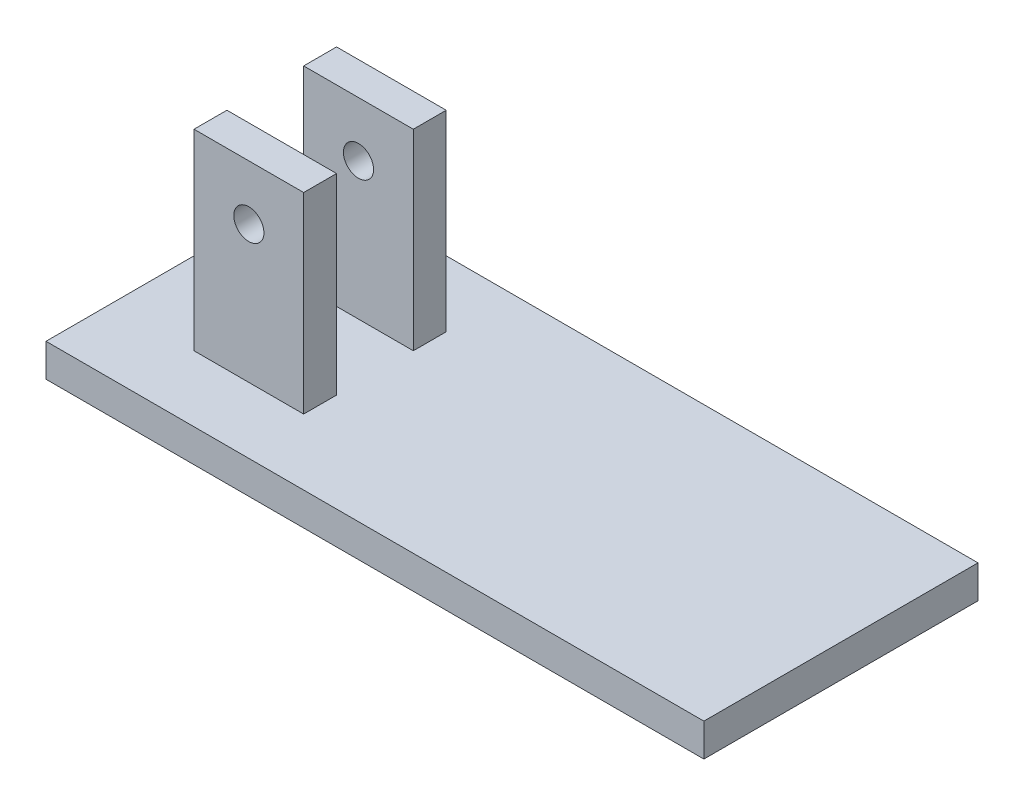
ISO-10303-21;
HEADER;
FILE_DESCRIPTION(('STEP AP214'),'2;1');
FILE_NAME('part.step','',(''),(''),'','','');
FILE_SCHEMA(('AUTOMOTIVE_DESIGN { 1 0 10303 214 1 1 1 1 }'));
ENDSEC;
DATA;
#1=APPLICATION_CONTEXT('core data for automotive mechanical design processes');
#2=APPLICATION_PROTOCOL_DEFINITION('international standard','automotive_design',2000,#1);
#3=PRODUCT_CONTEXT('',#1,'mechanical');
#4=PRODUCT('Part','Part','',(#3));
#5=PRODUCT_RELATED_PRODUCT_CATEGORY('part','',(#4));
#6=PRODUCT_DEFINITION_FORMATION('','',#4);
#7=PRODUCT_DEFINITION_CONTEXT('part definition',#1,'design');
#8=PRODUCT_DEFINITION('design','',#6,#7);
#9=PRODUCT_DEFINITION_SHAPE('','',#8);
#10=(LENGTH_UNIT() NAMED_UNIT(*) SI_UNIT(.MILLI.,.METRE.));
#11=(NAMED_UNIT(*) PLANE_ANGLE_UNIT() SI_UNIT($,.RADIAN.));
#12=(NAMED_UNIT(*) SI_UNIT($,.STERADIAN.) SOLID_ANGLE_UNIT());
#13=UNCERTAINTY_MEASURE_WITH_UNIT(LENGTH_MEASURE(1.E-05),#10,'distance_accuracy_value','');
#14=(GEOMETRIC_REPRESENTATION_CONTEXT(3) GLOBAL_UNCERTAINTY_ASSIGNED_CONTEXT((#13)) GLOBAL_UNIT_ASSIGNED_CONTEXT((#10,
#11,#12)) REPRESENTATION_CONTEXT('',''));
#15=CARTESIAN_POINT('',(0.,0.,0.));
#16=DIRECTION('',(0.,0.,1.));
#17=DIRECTION('',(1.,0.,0.));
#18=AXIS2_PLACEMENT_3D('',#15,#16,#17);
#19=CARTESIAN_POINT('',(0.,6.,0.));
#20=DIRECTION('',(0.,-1.,0.));
#21=DIRECTION('',(0.,0.,-1.));
#22=AXIS2_PLACEMENT_3D('',#19,#20,#21);
#23=PLANE('',#22);
#24=DIRECTION('',(0.,0.,1.));
#25=VECTOR('',#24,1.);
#26=CARTESIAN_POINT('',(-45.,6.,13.));
#27=LINE('',#26,#25);
#28=CARTESIAN_POINT('',(-45.,6.,7.));
#29=VERTEX_POINT('',#28);
#30=CARTESIAN_POINT('',(-45.,6.,13.));
#31=VERTEX_POINT('',#30);
#32=EDGE_CURVE('E159',#29,#31,#27,.T.);
#33=ORIENTED_EDGE('',*,*,#32,.F.);
#34=DIRECTION('',(-1.,0.,0.));
#35=VECTOR('',#34,1.);
#36=CARTESIAN_POINT('',(-45.,6.,7.));
#37=LINE('',#36,#35);
#38=CARTESIAN_POINT('',(-25.,6.,7.));
#39=VERTEX_POINT('',#38);
#40=EDGE_CURVE('E178',#39,#29,#37,.T.);
#41=ORIENTED_EDGE('',*,*,#40,.F.);
#42=DIRECTION('',(0.,0.,-1.));
#43=VECTOR('',#42,1.);
#44=CARTESIAN_POINT('',(-25.,6.,13.));
#45=LINE('',#44,#43);
#46=CARTESIAN_POINT('',(-25.,6.,13.));
#47=VERTEX_POINT('',#46);
#48=EDGE_CURVE('E186',#47,#39,#45,.T.);
#49=ORIENTED_EDGE('',*,*,#48,.F.);
#50=DIRECTION('',(1.,0.,0.));
#51=VECTOR('',#50,1.);
#52=CARTESIAN_POINT('',(-45.,6.,13.));
#53=LINE('',#52,#51);
#54=EDGE_CURVE('E164',#31,#47,#53,.T.);
#55=ORIENTED_EDGE('',*,*,#54,.F.);
#56=EDGE_LOOP('',(#33,#41,#49,#55));
#57=FACE_BOUND('',#56,.T.);
#58=DIRECTION('',(0.,0.,-1.));
#59=VECTOR('',#58,1.);
#60=CARTESIAN_POINT('',(60.,6.,25.));
#61=LINE('',#60,#59);
#62=CARTESIAN_POINT('',(60.,6.,25.));
#63=VERTEX_POINT('',#62);
#64=CARTESIAN_POINT('',(60.,6.,-25.));
#65=VERTEX_POINT('',#64);
#66=EDGE_CURVE('E215',#63,#65,#61,.T.);
#67=ORIENTED_EDGE('',*,*,#66,.T.);
#68=DIRECTION('',(-1.,0.,0.));
#69=VECTOR('',#68,1.);
#70=CARTESIAN_POINT('',(-60.,6.,-25.));
#71=LINE('',#70,#69);
#72=CARTESIAN_POINT('',(-60.,6.,-25.));
#73=VERTEX_POINT('',#72);
#74=EDGE_CURVE('E216',#65,#73,#71,.T.);
#75=ORIENTED_EDGE('',*,*,#74,.T.);
#76=DIRECTION('',(0.,0.,1.));
#77=VECTOR('',#76,1.);
#78=CARTESIAN_POINT('',(-60.,6.,25.));
#79=LINE('',#78,#77);
#80=CARTESIAN_POINT('',(-60.,6.,25.));
#81=VERTEX_POINT('',#80);
#82=EDGE_CURVE('E219',#73,#81,#79,.T.);
#83=ORIENTED_EDGE('',*,*,#82,.T.);
#84=DIRECTION('',(1.,0.,0.));
#85=VECTOR('',#84,1.);
#86=CARTESIAN_POINT('',(-60.,6.,25.));
#87=LINE('',#86,#85);
#88=EDGE_CURVE('E224',#81,#63,#87,.T.);
#89=ORIENTED_EDGE('',*,*,#88,.T.);
#90=EDGE_LOOP('',(#67,#75,#83,#89));
#91=FACE_BOUND('',#90,.T.);
#92=DIRECTION('',(0.,0.,1.));
#93=VECTOR('',#92,1.);
#94=CARTESIAN_POINT('',(-45.,6.,-13.));
#95=LINE('',#94,#93);
#96=CARTESIAN_POINT('',(-45.,6.,-13.));
#97=VERTEX_POINT('',#96);
#98=CARTESIAN_POINT('',(-45.,6.,-7.));
#99=VERTEX_POINT('',#98);
#100=EDGE_CURVE('E158',#97,#99,#95,.T.);
#101=ORIENTED_EDGE('',*,*,#100,.F.);
#102=DIRECTION('',(-1.,0.,0.));
#103=VECTOR('',#102,1.);
#104=CARTESIAN_POINT('',(-45.,6.,-13.));
#105=LINE('',#104,#103);
#106=CARTESIAN_POINT('',(-25.,6.,-13.));
#107=VERTEX_POINT('',#106);
#108=EDGE_CURVE('E154',#107,#97,#105,.T.);
#109=ORIENTED_EDGE('',*,*,#108,.F.);
#110=DIRECTION('',(0.,0.,-1.));
#111=VECTOR('',#110,1.);
#112=CARTESIAN_POINT('',(-25.,6.,-13.));
#113=LINE('',#112,#111);
#114=CARTESIAN_POINT('',(-25.,6.,-7.));
#115=VERTEX_POINT('',#114);
#116=EDGE_CURVE('E70',#115,#107,#113,.T.);
#117=ORIENTED_EDGE('',*,*,#116,.F.);
#118=DIRECTION('',(1.,0.,0.));
#119=VECTOR('',#118,1.);
#120=CARTESIAN_POINT('',(-45.,6.,-7.));
#121=LINE('',#120,#119);
#122=EDGE_CURVE('E65',#99,#115,#121,.T.);
#123=ORIENTED_EDGE('',*,*,#122,.F.);
#124=EDGE_LOOP('',(#101,#109,#117,#123));
#125=FACE_BOUND('',#124,.T.);
#126=ADVANCED_FACE('F44',(#57,#91,#125),#23,.F.);
#127=CARTESIAN_POINT('',(60.,6.,25.));
#128=DIRECTION('',(-1.,0.,0.));
#129=DIRECTION('',(0.,0.,1.));
#130=AXIS2_PLACEMENT_3D('',#127,#128,#129);
#131=PLANE('',#130);
#132=DIRECTION('',(0.,0.,-1.));
#133=VECTOR('',#132,1.);
#134=CARTESIAN_POINT('',(60.,0.,25.));
#135=LINE('',#134,#133);
#136=CARTESIAN_POINT('',(60.,0.,25.));
#137=VERTEX_POINT('',#136);
#138=CARTESIAN_POINT('',(60.,0.,-25.));
#139=VERTEX_POINT('',#138);
#140=EDGE_CURVE('E211',#137,#139,#135,.T.);
#141=ORIENTED_EDGE('',*,*,#140,.T.);
#142=DIRECTION('',(0.,-1.,0.));
#143=VECTOR('',#142,1.);
#144=CARTESIAN_POINT('',(60.,6.,-25.));
#145=LINE('',#144,#143);
#146=EDGE_CURVE('E11',#65,#139,#145,.T.);
#147=ORIENTED_EDGE('',*,*,#146,.F.);
#148=ORIENTED_EDGE('',*,*,#66,.F.);
#149=DIRECTION('',(0.,-1.,0.));
#150=VECTOR('',#149,1.);
#151=CARTESIAN_POINT('',(60.,6.,25.));
#152=LINE('',#151,#150);
#153=EDGE_CURVE('E227',#63,#137,#152,.T.);
#154=ORIENTED_EDGE('',*,*,#153,.T.);
#155=EDGE_LOOP('',(#141,#147,#148,#154));
#156=FACE_BOUND('',#155,.T.);
#157=ADVANCED_FACE('F50',(#156),#131,.F.);
#158=CARTESIAN_POINT('',(-60.,6.,-25.));
#159=DIRECTION('',(0.,0.,1.));
#160=DIRECTION('',(1.,0.,0.));
#161=AXIS2_PLACEMENT_3D('',#158,#159,#160);
#162=PLANE('',#161);
#163=DIRECTION('',(-1.,0.,0.));
#164=VECTOR('',#163,1.);
#165=CARTESIAN_POINT('',(-60.,0.,-25.));
#166=LINE('',#165,#164);
#167=CARTESIAN_POINT('',(-60.,0.,-25.));
#168=VERTEX_POINT('',#167);
#169=EDGE_CURVE('E228',#139,#168,#166,.T.);
#170=ORIENTED_EDGE('',*,*,#169,.T.);
#171=DIRECTION('',(0.,-1.,0.));
#172=VECTOR('',#171,1.);
#173=CARTESIAN_POINT('',(-60.,6.,-25.));
#174=LINE('',#173,#172);
#175=EDGE_CURVE('E54',#73,#168,#174,.T.);
#176=ORIENTED_EDGE('',*,*,#175,.F.);
#177=ORIENTED_EDGE('',*,*,#74,.F.);
#178=ORIENTED_EDGE('',*,*,#146,.T.);
#179=EDGE_LOOP('',(#170,#176,#177,#178));
#180=FACE_BOUND('',#179,.T.);
#181=ADVANCED_FACE('F266',(#180),#162,.F.);
#182=CARTESIAN_POINT('',(-60.,6.,25.));
#183=DIRECTION('',(1.,0.,0.));
#184=DIRECTION('',(0.,0.,-1.));
#185=AXIS2_PLACEMENT_3D('',#182,#183,#184);
#186=PLANE('',#185);
#187=DIRECTION('',(0.,0.,1.));
#188=VECTOR('',#187,1.);
#189=CARTESIAN_POINT('',(-60.,0.,25.));
#190=LINE('',#189,#188);
#191=CARTESIAN_POINT('',(-60.,0.,25.));
#192=VERTEX_POINT('',#191);
#193=EDGE_CURVE('E231',#168,#192,#190,.T.);
#194=ORIENTED_EDGE('',*,*,#193,.T.);
#195=DIRECTION('',(0.,-1.,0.));
#196=VECTOR('',#195,1.);
#197=CARTESIAN_POINT('',(-60.,6.,25.));
#198=LINE('',#197,#196);
#199=EDGE_CURVE('E242',#81,#192,#198,.T.);
#200=ORIENTED_EDGE('',*,*,#199,.F.);
#201=ORIENTED_EDGE('',*,*,#82,.F.);
#202=ORIENTED_EDGE('',*,*,#175,.T.);
#203=EDGE_LOOP('',(#194,#200,#201,#202));
#204=FACE_BOUND('',#203,.T.);
#205=ADVANCED_FACE('F253',(#204),#186,.F.);
#206=CARTESIAN_POINT('',(-60.,6.,25.));
#207=DIRECTION('',(0.,0.,-1.));
#208=DIRECTION('',(-1.,0.,0.));
#209=AXIS2_PLACEMENT_3D('',#206,#207,#208);
#210=PLANE('',#209);
#211=DIRECTION('',(1.,0.,0.));
#212=VECTOR('',#211,1.);
#213=CARTESIAN_POINT('',(-60.,0.,25.));
#214=LINE('',#213,#212);
#215=EDGE_CURVE('E220',#192,#137,#214,.T.);
#216=ORIENTED_EDGE('',*,*,#215,.T.);
#217=ORIENTED_EDGE('',*,*,#153,.F.);
#218=ORIENTED_EDGE('',*,*,#88,.F.);
#219=ORIENTED_EDGE('',*,*,#199,.T.);
#220=EDGE_LOOP('',(#216,#217,#218,#219));
#221=FACE_BOUND('',#220,.T.);
#222=ADVANCED_FACE('F257',(#221),#210,.F.);
#223=CARTESIAN_POINT('',(0.,0.,0.));
#224=DIRECTION('',(0.,-1.,0.));
#225=DIRECTION('',(0.,0.,-1.));
#226=AXIS2_PLACEMENT_3D('',#223,#224,#225);
#227=PLANE('',#226);
#228=ORIENTED_EDGE('',*,*,#140,.F.);
#229=ORIENTED_EDGE('',*,*,#215,.F.);
#230=ORIENTED_EDGE('',*,*,#193,.F.);
#231=ORIENTED_EDGE('',*,*,#169,.F.);
#232=EDGE_LOOP('',(#228,#229,#230,#231));
#233=FACE_BOUND('',#232,.T.);
#234=ADVANCED_FACE('F260',(#233),#227,.T.);
#235=CARTESIAN_POINT('',(-45.,41.,13.));
#236=DIRECTION('',(1.,0.,0.));
#237=DIRECTION('',(0.,0.,-1.));
#238=AXIS2_PLACEMENT_3D('',#235,#236,#237);
#239=PLANE('',#238);
#240=ORIENTED_EDGE('',*,*,#32,.T.);
#241=DIRECTION('',(0.,-1.,0.));
#242=VECTOR('',#241,1.);
#243=CARTESIAN_POINT('',(-45.,41.,13.));
#244=LINE('',#243,#242);
#245=CARTESIAN_POINT('',(-45.,41.,13.));
#246=VERTEX_POINT('',#245);
#247=EDGE_CURVE('E210',#246,#31,#244,.T.);
#248=ORIENTED_EDGE('',*,*,#247,.F.);
#249=DIRECTION('',(0.,0.,1.));
#250=VECTOR('',#249,1.);
#251=CARTESIAN_POINT('',(-45.,41.,13.));
#252=LINE('',#251,#250);
#253=CARTESIAN_POINT('',(-45.,41.,7.));
#254=VERTEX_POINT('',#253);
#255=EDGE_CURVE('E172',#254,#246,#252,.T.);
#256=ORIENTED_EDGE('',*,*,#255,.F.);
#257=DIRECTION('',(0.,-1.,0.));
#258=VECTOR('',#257,1.);
#259=CARTESIAN_POINT('',(-45.,41.,7.));
#260=LINE('',#259,#258);
#261=EDGE_CURVE('E184',#254,#29,#260,.T.);
#262=ORIENTED_EDGE('',*,*,#261,.T.);
#263=EDGE_LOOP('',(#240,#248,#256,#262));
#264=FACE_BOUND('',#263,.T.);
#265=ADVANCED_FACE('F285',(#264),#239,.F.);
#266=CARTESIAN_POINT('',(-45.,41.,13.));
#267=DIRECTION('',(0.,0.,-1.));
#268=DIRECTION('',(-1.,0.,0.));
#269=AXIS2_PLACEMENT_3D('',#266,#267,#268);
#270=PLANE('',#269);
#271=CARTESIAN_POINT('',(-35.,31.,13.));
#272=DIRECTION('',(0.,0.,-1.));
#273=DIRECTION('',(-1.,0.,0.));
#274=AXIS2_PLACEMENT_3D('',#271,#272,#273);
#275=CIRCLE('',#274,2.75);
#276=CARTESIAN_POINT('',(-37.75,31.,13.));
#277=VERTEX_POINT('',#276);
#278=EDGE_CURVE('E406',#277,#277,#275,.T.);
#279=ORIENTED_EDGE('',*,*,#278,.T.);
#280=EDGE_LOOP('',(#279));
#281=FACE_BOUND('',#280,.T.);
#282=ORIENTED_EDGE('',*,*,#54,.T.);
#283=DIRECTION('',(0.,-1.,0.));
#284=VECTOR('',#283,1.);
#285=CARTESIAN_POINT('',(-25.,41.,13.));
#286=LINE('',#285,#284);
#287=CARTESIAN_POINT('',(-25.,41.,13.));
#288=VERTEX_POINT('',#287);
#289=EDGE_CURVE('E201',#288,#47,#286,.T.);
#290=ORIENTED_EDGE('',*,*,#289,.F.);
#291=DIRECTION('',(1.,0.,0.));
#292=VECTOR('',#291,1.);
#293=CARTESIAN_POINT('',(-45.,41.,13.));
#294=LINE('',#293,#292);
#295=EDGE_CURVE('E173',#246,#288,#294,.T.);
#296=ORIENTED_EDGE('',*,*,#295,.F.);
#297=ORIENTED_EDGE('',*,*,#247,.T.);
#298=EDGE_LOOP('',(#282,#290,#296,#297));
#299=FACE_BOUND('',#298,.T.);
#300=ADVANCED_FACE('F301',(#281,#299),#270,.F.);
#301=CARTESIAN_POINT('',(-25.,41.,13.));
#302=DIRECTION('',(-1.,0.,0.));
#303=DIRECTION('',(0.,0.,1.));
#304=AXIS2_PLACEMENT_3D('',#301,#302,#303);
#305=PLANE('',#304);
#306=ORIENTED_EDGE('',*,*,#48,.T.);
#307=DIRECTION('',(0.,-1.,0.));
#308=VECTOR('',#307,1.);
#309=CARTESIAN_POINT('',(-25.,41.,7.));
#310=LINE('',#309,#308);
#311=CARTESIAN_POINT('',(-25.,41.,7.));
#312=VERTEX_POINT('',#311);
#313=EDGE_CURVE('E200',#312,#39,#310,.T.);
#314=ORIENTED_EDGE('',*,*,#313,.F.);
#315=DIRECTION('',(0.,0.,-1.));
#316=VECTOR('',#315,1.);
#317=CARTESIAN_POINT('',(-25.,41.,13.));
#318=LINE('',#317,#316);
#319=EDGE_CURVE('E179',#288,#312,#318,.T.);
#320=ORIENTED_EDGE('',*,*,#319,.F.);
#321=ORIENTED_EDGE('',*,*,#289,.T.);
#322=EDGE_LOOP('',(#306,#314,#320,#321));
#323=FACE_BOUND('',#322,.T.);
#324=ADVANCED_FACE('F310',(#323),#305,.F.);
#325=CARTESIAN_POINT('',(-45.,41.,7.));
#326=DIRECTION('',(0.,0.,1.));
#327=DIRECTION('',(1.,0.,0.));
#328=AXIS2_PLACEMENT_3D('',#325,#326,#327);
#329=PLANE('',#328);
#330=CARTESIAN_POINT('',(-35.,31.,7.));
#331=DIRECTION('',(0.,0.,1.));
#332=DIRECTION('',(1.,0.,0.));
#333=AXIS2_PLACEMENT_3D('',#330,#331,#332);
#334=CIRCLE('',#333,2.75);
#335=CARTESIAN_POINT('',(-32.25,31.,7.));
#336=VERTEX_POINT('',#335);
#337=EDGE_CURVE('E420',#336,#336,#334,.T.);
#338=ORIENTED_EDGE('',*,*,#337,.T.);
#339=EDGE_LOOP('',(#338));
#340=FACE_BOUND('',#339,.T.);
#341=ORIENTED_EDGE('',*,*,#40,.T.);
#342=ORIENTED_EDGE('',*,*,#261,.F.);
#343=DIRECTION('',(-1.,0.,0.));
#344=VECTOR('',#343,1.);
#345=CARTESIAN_POINT('',(-45.,41.,7.));
#346=LINE('',#345,#344);
#347=EDGE_CURVE('E185',#312,#254,#346,.T.);
#348=ORIENTED_EDGE('',*,*,#347,.F.);
#349=ORIENTED_EDGE('',*,*,#313,.T.);
#350=EDGE_LOOP('',(#341,#342,#348,#349));
#351=FACE_BOUND('',#350,.T.);
#352=ADVANCED_FACE('F315',(#340,#351),#329,.F.);
#353=CARTESIAN_POINT('',(0.,41.,0.));
#354=DIRECTION('',(0.,-1.,0.));
#355=DIRECTION('',(0.,0.,-1.));
#356=AXIS2_PLACEMENT_3D('',#353,#354,#355);
#357=PLANE('',#356);
#358=ORIENTED_EDGE('',*,*,#255,.T.);
#359=ORIENTED_EDGE('',*,*,#295,.T.);
#360=ORIENTED_EDGE('',*,*,#319,.T.);
#361=ORIENTED_EDGE('',*,*,#347,.T.);
#362=EDGE_LOOP('',(#358,#359,#360,#361));
#363=FACE_BOUND('',#362,.T.);
#364=ADVANCED_FACE('F317',(#363),#357,.F.);
#365=CARTESIAN_POINT('',(-45.,41.,-13.));
#366=DIRECTION('',(1.,0.,0.));
#367=DIRECTION('',(0.,0.,-1.));
#368=AXIS2_PLACEMENT_3D('',#365,#366,#367);
#369=PLANE('',#368);
#370=ORIENTED_EDGE('',*,*,#100,.T.);
#371=DIRECTION('',(0.,-1.,0.));
#372=VECTOR('',#371,1.);
#373=CARTESIAN_POINT('',(-45.,41.,-7.));
#374=LINE('',#373,#372);
#375=CARTESIAN_POINT('',(-45.,41.,-7.));
#376=VERTEX_POINT('',#375);
#377=EDGE_CURVE('E140',#376,#99,#374,.T.);
#378=ORIENTED_EDGE('',*,*,#377,.F.);
#379=DIRECTION('',(0.,0.,1.));
#380=VECTOR('',#379,1.);
#381=CARTESIAN_POINT('',(-45.,41.,-13.));
#382=LINE('',#381,#380);
#383=CARTESIAN_POINT('',(-45.,41.,-13.));
#384=VERTEX_POINT('',#383);
#385=EDGE_CURVE('E144',#384,#376,#382,.T.);
#386=ORIENTED_EDGE('',*,*,#385,.F.);
#387=DIRECTION('',(0.,-1.,0.));
#388=VECTOR('',#387,1.);
#389=CARTESIAN_POINT('',(-45.,41.,-13.));
#390=LINE('',#389,#388);
#391=EDGE_CURVE('E435',#384,#97,#390,.T.);
#392=ORIENTED_EDGE('',*,*,#391,.T.);
#393=EDGE_LOOP('',(#370,#378,#386,#392));
#394=FACE_BOUND('',#393,.T.);
#395=ADVANCED_FACE('F160',(#394),#369,.F.);
#396=CARTESIAN_POINT('',(-45.,41.,-7.));
#397=DIRECTION('',(0.,0.,-1.));
#398=DIRECTION('',(-1.,0.,0.));
#399=AXIS2_PLACEMENT_3D('',#396,#397,#398);
#400=PLANE('',#399);
#401=CARTESIAN_POINT('',(-35.,31.,-7.));
#402=DIRECTION('',(0.,0.,-1.));
#403=DIRECTION('',(-1.,0.,0.));
#404=AXIS2_PLACEMENT_3D('',#401,#402,#403);
#405=CIRCLE('',#404,2.75);
#406=CARTESIAN_POINT('',(-37.75,31.,-7.));
#407=VERTEX_POINT('',#406);
#408=EDGE_CURVE('E422',#407,#407,#405,.T.);
#409=ORIENTED_EDGE('',*,*,#408,.T.);
#410=EDGE_LOOP('',(#409));
#411=FACE_BOUND('',#410,.T.);
#412=ORIENTED_EDGE('',*,*,#122,.T.);
#413=DIRECTION('',(0.,-1.,0.));
#414=VECTOR('',#413,1.);
#415=CARTESIAN_POINT('',(-25.,41.,-7.));
#416=LINE('',#415,#414);
#417=CARTESIAN_POINT('',(-25.,41.,-7.));
#418=VERTEX_POINT('',#417);
#419=EDGE_CURVE('E137',#418,#115,#416,.T.);
#420=ORIENTED_EDGE('',*,*,#419,.F.);
#421=DIRECTION('',(1.,0.,0.));
#422=VECTOR('',#421,1.);
#423=CARTESIAN_POINT('',(-45.,41.,-7.));
#424=LINE('',#423,#422);
#425=EDGE_CURVE('E134',#376,#418,#424,.T.);
#426=ORIENTED_EDGE('',*,*,#425,.F.);
#427=ORIENTED_EDGE('',*,*,#377,.T.);
#428=EDGE_LOOP('',(#412,#420,#426,#427));
#429=FACE_BOUND('',#428,.T.);
#430=ADVANCED_FACE('F133',(#411,#429),#400,.F.);
#431=CARTESIAN_POINT('',(-25.,41.,-13.));
#432=DIRECTION('',(-1.,0.,0.));
#433=DIRECTION('',(0.,0.,1.));
#434=AXIS2_PLACEMENT_3D('',#431,#432,#433);
#435=PLANE('',#434);
#436=ORIENTED_EDGE('',*,*,#116,.T.);
#437=DIRECTION('',(0.,-1.,0.));
#438=VECTOR('',#437,1.);
#439=CARTESIAN_POINT('',(-25.,41.,-13.));
#440=LINE('',#439,#438);
#441=CARTESIAN_POINT('',(-25.,41.,-13.));
#442=VERTEX_POINT('',#441);
#443=EDGE_CURVE('E170',#442,#107,#440,.T.);
#444=ORIENTED_EDGE('',*,*,#443,.F.);
#445=DIRECTION('',(0.,0.,-1.));
#446=VECTOR('',#445,1.);
#447=CARTESIAN_POINT('',(-25.,41.,-13.));
#448=LINE('',#447,#446);
#449=EDGE_CURVE('E145',#418,#442,#448,.T.);
#450=ORIENTED_EDGE('',*,*,#449,.F.);
#451=ORIENTED_EDGE('',*,*,#419,.T.);
#452=EDGE_LOOP('',(#436,#444,#450,#451));
#453=FACE_BOUND('',#452,.T.);
#454=ADVANCED_FACE('F348',(#453),#435,.F.);
#455=CARTESIAN_POINT('',(-45.,41.,-13.));
#456=DIRECTION('',(0.,0.,1.));
#457=DIRECTION('',(1.,0.,0.));
#458=AXIS2_PLACEMENT_3D('',#455,#456,#457);
#459=PLANE('',#458);
#460=CARTESIAN_POINT('',(-35.,31.,-13.));
#461=DIRECTION('',(0.,0.,1.));
#462=DIRECTION('',(1.,0.,0.));
#463=AXIS2_PLACEMENT_3D('',#460,#461,#462);
#464=CIRCLE('',#463,2.75);
#465=CARTESIAN_POINT('',(-32.25,31.,-13.));
#466=VERTEX_POINT('',#465);
#467=EDGE_CURVE('E47',#466,#466,#464,.T.);
#468=ORIENTED_EDGE('',*,*,#467,.T.);
#469=EDGE_LOOP('',(#468));
#470=FACE_BOUND('',#469,.T.);
#471=ORIENTED_EDGE('',*,*,#108,.T.);
#472=ORIENTED_EDGE('',*,*,#391,.F.);
#473=DIRECTION('',(-1.,0.,0.));
#474=VECTOR('',#473,1.);
#475=CARTESIAN_POINT('',(-45.,41.,-13.));
#476=LINE('',#475,#474);
#477=EDGE_CURVE('E147',#442,#384,#476,.T.);
#478=ORIENTED_EDGE('',*,*,#477,.F.);
#479=ORIENTED_EDGE('',*,*,#443,.T.);
#480=EDGE_LOOP('',(#471,#472,#478,#479));
#481=FACE_BOUND('',#480,.T.);
#482=ADVANCED_FACE('F357',(#470,#481),#459,.F.);
#483=CARTESIAN_POINT('',(0.,41.,0.));
#484=DIRECTION('',(0.,1.,0.));
#485=DIRECTION('',(0.,0.,1.));
#486=AXIS2_PLACEMENT_3D('',#483,#484,#485);
#487=PLANE('',#486);
#488=ORIENTED_EDGE('',*,*,#385,.T.);
#489=ORIENTED_EDGE('',*,*,#425,.T.);
#490=ORIENTED_EDGE('',*,*,#449,.T.);
#491=ORIENTED_EDGE('',*,*,#477,.T.);
#492=EDGE_LOOP('',(#488,#489,#490,#491));
#493=FACE_BOUND('',#492,.T.);
#494=ADVANCED_FACE('F146',(#493),#487,.T.);
#495=CARTESIAN_POINT('',(-35.,31.,-25.));
#496=DIRECTION('',(0.,0.,1.));
#497=DIRECTION('',(1.,0.,0.));
#498=AXIS2_PLACEMENT_3D('',#495,#496,#497);
#499=CYLINDRICAL_SURFACE('',#498,2.75);
#500=ORIENTED_EDGE('',*,*,#467,.F.);
#501=EDGE_LOOP('',(#500));
#502=FACE_BOUND('',#501,.T.);
#503=ORIENTED_EDGE('',*,*,#408,.F.);
#504=EDGE_LOOP('',(#503));
#505=FACE_BOUND('',#504,.T.);
#506=ADVANCED_FACE('F377',(#502,#505),#499,.F.);
#507=ORIENTED_EDGE('',*,*,#337,.F.);
#508=EDGE_LOOP('',(#507));
#509=FACE_BOUND('',#508,.T.);
#510=ORIENTED_EDGE('',*,*,#278,.F.);
#511=EDGE_LOOP('',(#510));
#512=FACE_BOUND('',#511,.T.);
#513=ADVANCED_FACE('F389',(#509,#512),#499,.F.);
#514=CLOSED_SHELL('',(#126,#157,#181,#205,#222,#234,#265,#300,#324,#352,#364,#395,#430,#454,
#482,#494,#506,#513));
#515=MANIFOLD_SOLID_BREP('B2',#514);
#516=ADVANCED_BREP_SHAPE_REPRESENTATION('',(#18,#515),#14);
#517=SHAPE_DEFINITION_REPRESENTATION(#9,#516);
ENDSEC;
END-ISO-10303-21;
